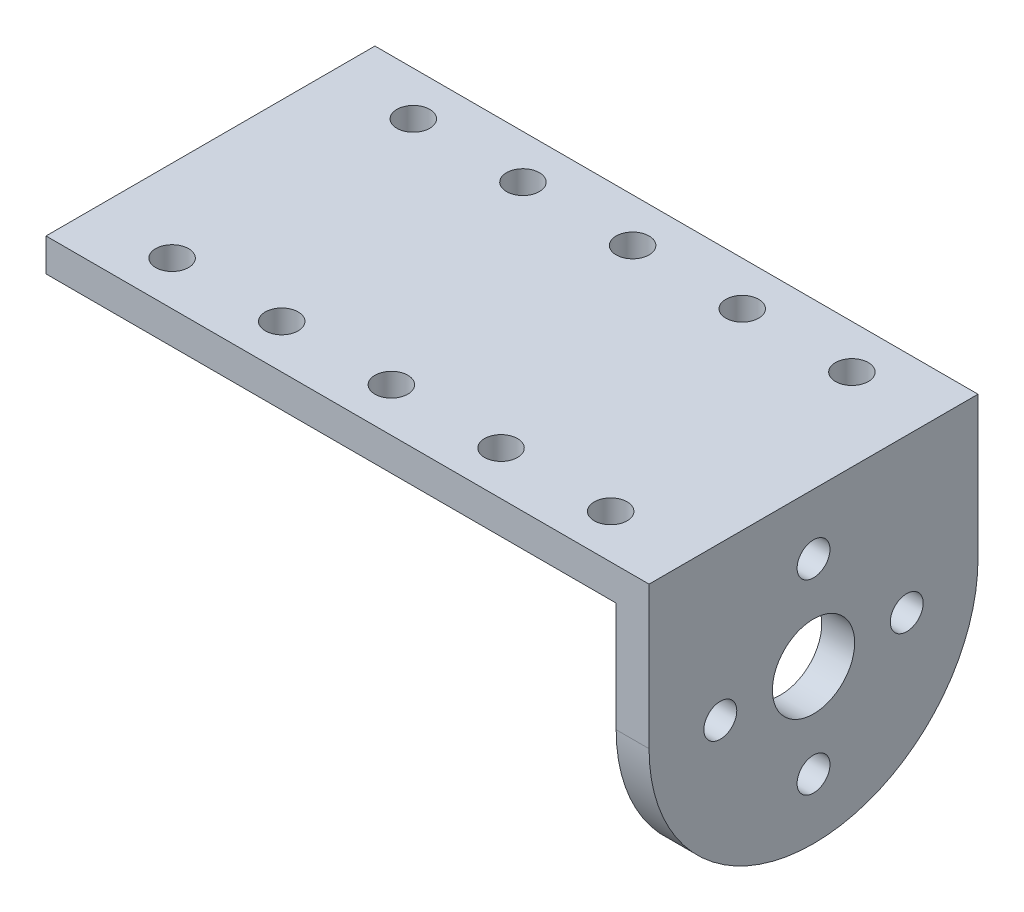
ISO-10303-21;
HEADER;
FILE_DESCRIPTION(('STEP AP214'),'2;1');
FILE_NAME('part.step','',(''),(''),'','','');
FILE_SCHEMA(('AUTOMOTIVE_DESIGN { 1 0 10303 214 1 1 1 1 }'));
ENDSEC;
DATA;
#1=APPLICATION_CONTEXT('core data for automotive mechanical design processes');
#2=APPLICATION_PROTOCOL_DEFINITION('international standard','automotive_design',2000,#1);
#3=PRODUCT_CONTEXT('',#1,'mechanical');
#4=PRODUCT('Part','Part','',(#3));
#5=PRODUCT_RELATED_PRODUCT_CATEGORY('part','',(#4));
#6=PRODUCT_DEFINITION_FORMATION('','',#4);
#7=PRODUCT_DEFINITION_CONTEXT('part definition',#1,'design');
#8=PRODUCT_DEFINITION('design','',#6,#7);
#9=PRODUCT_DEFINITION_SHAPE('','',#8);
#10=(LENGTH_UNIT() NAMED_UNIT(*) SI_UNIT(.MILLI.,.METRE.));
#11=(NAMED_UNIT(*) PLANE_ANGLE_UNIT() SI_UNIT($,.RADIAN.));
#12=(NAMED_UNIT(*) SI_UNIT($,.STERADIAN.) SOLID_ANGLE_UNIT());
#13=UNCERTAINTY_MEASURE_WITH_UNIT(LENGTH_MEASURE(1.E-05),#10,'distance_accuracy_value','');
#14=(GEOMETRIC_REPRESENTATION_CONTEXT(3) GLOBAL_UNCERTAINTY_ASSIGNED_CONTEXT((#13)) GLOBAL_UNIT_ASSIGNED_CONTEXT((#10,
#11,#12)) REPRESENTATION_CONTEXT('',''));
#15=CARTESIAN_POINT('',(0.,0.,0.));
#16=DIRECTION('',(0.,0.,1.));
#17=DIRECTION('',(1.,0.,0.));
#18=AXIS2_PLACEMENT_3D('',#15,#16,#17);
#19=CARTESIAN_POINT('',(0.,0.,0.));
#20=DIRECTION('',(0.,1.,0.));
#21=DIRECTION('',(0.,0.,1.));
#22=AXIS2_PLACEMENT_3D('',#19,#20,#21);
#23=PLANE('',#22);
#24=CARTESIAN_POINT('',(-20.,0.,10.9999999999997));
#25=DIRECTION('',(0.,1.,0.));
#26=DIRECTION('',(0.,0.,-1.));
#27=AXIS2_PLACEMENT_3D('',#24,#25,#26);
#28=CIRCLE('',#27,1.5);
#29=CARTESIAN_POINT('',(-20.,0.,9.49999999999972));
#30=VERTEX_POINT('',#29);
#31=EDGE_CURVE('E132',#30,#30,#28,.T.);
#32=ORIENTED_EDGE('',*,*,#31,.T.);
#33=EDGE_LOOP('',(#32));
#34=FACE_BOUND('',#33,.T.);
#35=CARTESIAN_POINT('',(-10.,0.,10.9999999999998));
#36=DIRECTION('',(0.,1.,0.));
#37=DIRECTION('',(0.,0.,-1.));
#38=AXIS2_PLACEMENT_3D('',#35,#36,#37);
#39=CIRCLE('',#38,1.5);
#40=CARTESIAN_POINT('',(-10.,0.,9.49999999999979));
#41=VERTEX_POINT('',#40);
#42=EDGE_CURVE('E137',#41,#41,#39,.T.);
#43=ORIENTED_EDGE('',*,*,#42,.T.);
#44=EDGE_LOOP('',(#43));
#45=FACE_BOUND('',#44,.T.);
#46=CARTESIAN_POINT('',(0.,0.,10.9999999999999));
#47=DIRECTION('',(0.,1.,0.));
#48=DIRECTION('',(0.,0.,-1.));
#49=AXIS2_PLACEMENT_3D('',#46,#47,#48);
#50=CIRCLE('',#49,1.5);
#51=CARTESIAN_POINT('',(0.,0.,9.49999999999986));
#52=VERTEX_POINT('',#51);
#53=EDGE_CURVE('E145',#52,#52,#50,.T.);
#54=ORIENTED_EDGE('',*,*,#53,.T.);
#55=EDGE_LOOP('',(#54));
#56=FACE_BOUND('',#55,.T.);
#57=CARTESIAN_POINT('',(10.,0.,10.9999999999999));
#58=DIRECTION('',(0.,1.,0.));
#59=DIRECTION('',(0.,0.,-1.));
#60=AXIS2_PLACEMENT_3D('',#57,#58,#59);
#61=CIRCLE('',#60,1.5);
#62=CARTESIAN_POINT('',(10.,0.,9.49999999999993));
#63=VERTEX_POINT('',#62);
#64=EDGE_CURVE('E153',#63,#63,#61,.T.);
#65=ORIENTED_EDGE('',*,*,#64,.T.);
#66=EDGE_LOOP('',(#65));
#67=FACE_BOUND('',#66,.T.);
#68=CARTESIAN_POINT('',(20.,0.,11.));
#69=DIRECTION('',(0.,1.,0.));
#70=DIRECTION('',(0.,0.,-1.));
#71=AXIS2_PLACEMENT_3D('',#68,#69,#70);
#72=CIRCLE('',#71,1.5);
#73=CARTESIAN_POINT('',(20.,0.,9.5));
#74=VERTEX_POINT('',#73);
#75=EDGE_CURVE('E161',#74,#74,#72,.T.);
#76=ORIENTED_EDGE('',*,*,#75,.T.);
#77=EDGE_LOOP('',(#76));
#78=FACE_BOUND('',#77,.T.);
#79=CARTESIAN_POINT('',(-20.,0.,-10.9999999999997));
#80=DIRECTION('',(0.,1.,0.));
#81=DIRECTION('',(0.,0.,1.));
#82=AXIS2_PLACEMENT_3D('',#79,#80,#81);
#83=CIRCLE('',#82,1.5);
#84=CARTESIAN_POINT('',(-20.,0.,-9.49999999999972));
#85=VERTEX_POINT('',#84);
#86=EDGE_CURVE('E169',#85,#85,#83,.T.);
#87=ORIENTED_EDGE('',*,*,#86,.T.);
#88=EDGE_LOOP('',(#87));
#89=FACE_BOUND('',#88,.T.);
#90=CARTESIAN_POINT('',(-10.,0.,-10.9999999999998));
#91=DIRECTION('',(0.,1.,0.));
#92=DIRECTION('',(0.,0.,1.));
#93=AXIS2_PLACEMENT_3D('',#90,#91,#92);
#94=CIRCLE('',#93,1.5);
#95=CARTESIAN_POINT('',(-10.,0.,-9.49999999999979));
#96=VERTEX_POINT('',#95);
#97=EDGE_CURVE('E177',#96,#96,#94,.T.);
#98=ORIENTED_EDGE('',*,*,#97,.T.);
#99=EDGE_LOOP('',(#98));
#100=FACE_BOUND('',#99,.T.);
#101=CARTESIAN_POINT('',(0.,0.,-10.9999999999999));
#102=DIRECTION('',(0.,1.,0.));
#103=DIRECTION('',(0.,0.,1.));
#104=AXIS2_PLACEMENT_3D('',#101,#102,#103);
#105=CIRCLE('',#104,1.5);
#106=CARTESIAN_POINT('',(0.,0.,-9.49999999999986));
#107=VERTEX_POINT('',#106);
#108=EDGE_CURVE('E185',#107,#107,#105,.T.);
#109=ORIENTED_EDGE('',*,*,#108,.T.);
#110=EDGE_LOOP('',(#109));
#111=FACE_BOUND('',#110,.T.);
#112=CARTESIAN_POINT('',(10.,0.,-10.9999999999999));
#113=DIRECTION('',(0.,1.,0.));
#114=DIRECTION('',(0.,0.,1.));
#115=AXIS2_PLACEMENT_3D('',#112,#113,#114);
#116=CIRCLE('',#115,1.5);
#117=CARTESIAN_POINT('',(10.,0.,-9.49999999999993));
#118=VERTEX_POINT('',#117);
#119=EDGE_CURVE('E193',#118,#118,#116,.T.);
#120=ORIENTED_EDGE('',*,*,#119,.T.);
#121=EDGE_LOOP('',(#120));
#122=FACE_BOUND('',#121,.T.);
#123=CARTESIAN_POINT('',(20.,0.,-11.));
#124=DIRECTION('',(0.,1.,0.));
#125=DIRECTION('',(0.,0.,1.));
#126=AXIS2_PLACEMENT_3D('',#123,#124,#125);
#127=CIRCLE('',#126,1.5);
#128=CARTESIAN_POINT('',(20.,0.,-9.5));
#129=VERTEX_POINT('',#128);
#130=EDGE_CURVE('E201',#129,#129,#127,.T.);
#131=ORIENTED_EDGE('',*,*,#130,.T.);
#132=EDGE_LOOP('',(#131));
#133=FACE_BOUND('',#132,.T.);
#134=DIRECTION('',(0.,0.,-1.));
#135=VECTOR('',#134,1.);
#136=CARTESIAN_POINT('',(24.5,0.,15.));
#137=LINE('',#136,#135);
#138=CARTESIAN_POINT('',(24.5,0.,15.));
#139=VERTEX_POINT('',#138);
#140=CARTESIAN_POINT('',(24.5,0.,-15.));
#141=VERTEX_POINT('',#140);
#142=EDGE_CURVE('E107',#139,#141,#137,.T.);
#143=ORIENTED_EDGE('',*,*,#142,.F.);
#144=DIRECTION('',(1.,0.,0.));
#145=VECTOR('',#144,1.);
#146=CARTESIAN_POINT('',(-27.5,0.,15.));
#147=LINE('',#146,#145);
#148=CARTESIAN_POINT('',(-27.5,0.,15.));
#149=VERTEX_POINT('',#148);
#150=EDGE_CURVE('E216',#149,#139,#147,.T.);
#151=ORIENTED_EDGE('',*,*,#150,.F.);
#152=DIRECTION('',(0.,0.,1.));
#153=VECTOR('',#152,1.);
#154=CARTESIAN_POINT('',(-27.5,0.,-15.));
#155=LINE('',#154,#153);
#156=CARTESIAN_POINT('',(-27.5,0.,-15.));
#157=VERTEX_POINT('',#156);
#158=EDGE_CURVE('E114',#157,#149,#155,.T.);
#159=ORIENTED_EDGE('',*,*,#158,.F.);
#160=DIRECTION('',(-1.,0.,0.));
#161=VECTOR('',#160,1.);
#162=CARTESIAN_POINT('',(-27.5,0.,-15.));
#163=LINE('',#162,#161);
#164=EDGE_CURVE('E100',#141,#157,#163,.T.);
#165=ORIENTED_EDGE('',*,*,#164,.F.);
#166=EDGE_LOOP('',(#143,#151,#159,#165));
#167=FACE_BOUND('',#166,.T.);
#168=ADVANCED_FACE('F39',(#34,#45,#56,#67,#78,#89,#100,#111,#122,#133,#167),#23,.F.);
#169=CARTESIAN_POINT('',(0.,3.,0.));
#170=DIRECTION('',(0.,1.,0.));
#171=DIRECTION('',(0.,0.,1.));
#172=AXIS2_PLACEMENT_3D('',#169,#170,#171);
#173=PLANE('',#172);
#174=CARTESIAN_POINT('',(-10.,3.,10.9999999999998));
#175=DIRECTION('',(0.,1.,0.));
#176=DIRECTION('',(0.,0.,-1.));
#177=AXIS2_PLACEMENT_3D('',#174,#175,#176);
#178=CIRCLE('',#177,1.5);
#179=CARTESIAN_POINT('',(-10.,3.,9.49999999999979));
#180=VERTEX_POINT('',#179);
#181=EDGE_CURVE('E141',#180,#180,#178,.T.);
#182=ORIENTED_EDGE('',*,*,#181,.F.);
#183=EDGE_LOOP('',(#182));
#184=FACE_BOUND('',#183,.T.);
#185=CARTESIAN_POINT('',(10.,3.,10.9999999999999));
#186=DIRECTION('',(0.,1.,0.));
#187=DIRECTION('',(0.,0.,-1.));
#188=AXIS2_PLACEMENT_3D('',#185,#186,#187);
#189=CIRCLE('',#188,1.5);
#190=CARTESIAN_POINT('',(10.,3.,9.49999999999993));
#191=VERTEX_POINT('',#190);
#192=EDGE_CURVE('E157',#191,#191,#189,.T.);
#193=ORIENTED_EDGE('',*,*,#192,.F.);
#194=EDGE_LOOP('',(#193));
#195=FACE_BOUND('',#194,.T.);
#196=CARTESIAN_POINT('',(-20.,3.,-10.9999999999997));
#197=DIRECTION('',(0.,1.,0.));
#198=DIRECTION('',(0.,0.,1.));
#199=AXIS2_PLACEMENT_3D('',#196,#197,#198);
#200=CIRCLE('',#199,1.5);
#201=CARTESIAN_POINT('',(-20.,3.,-9.49999999999972));
#202=VERTEX_POINT('',#201);
#203=EDGE_CURVE('E173',#202,#202,#200,.T.);
#204=ORIENTED_EDGE('',*,*,#203,.F.);
#205=EDGE_LOOP('',(#204));
#206=FACE_BOUND('',#205,.T.);
#207=CARTESIAN_POINT('',(0.,3.,-10.9999999999999));
#208=DIRECTION('',(0.,1.,0.));
#209=DIRECTION('',(0.,0.,1.));
#210=AXIS2_PLACEMENT_3D('',#207,#208,#209);
#211=CIRCLE('',#210,1.5);
#212=CARTESIAN_POINT('',(0.,3.,-9.49999999999986));
#213=VERTEX_POINT('',#212);
#214=EDGE_CURVE('E189',#213,#213,#211,.T.);
#215=ORIENTED_EDGE('',*,*,#214,.F.);
#216=EDGE_LOOP('',(#215));
#217=FACE_BOUND('',#216,.T.);
#218=CARTESIAN_POINT('',(20.,3.,-11.));
#219=DIRECTION('',(0.,1.,0.));
#220=DIRECTION('',(0.,0.,1.));
#221=AXIS2_PLACEMENT_3D('',#218,#219,#220);
#222=CIRCLE('',#221,1.5);
#223=CARTESIAN_POINT('',(20.,3.,-9.5));
#224=VERTEX_POINT('',#223);
#225=EDGE_CURVE('E116',#224,#224,#222,.T.);
#226=ORIENTED_EDGE('',*,*,#225,.F.);
#227=EDGE_LOOP('',(#226));
#228=FACE_BOUND('',#227,.T.);
#229=DIRECTION('',(0.,0.,-1.));
#230=VECTOR('',#229,1.);
#231=CARTESIAN_POINT('',(27.5,3.,-15.));
#232=LINE('',#231,#230);
#233=CARTESIAN_POINT('',(27.5,3.,15.));
#234=VERTEX_POINT('',#233);
#235=CARTESIAN_POINT('',(27.5,3.,-15.));
#236=VERTEX_POINT('',#235);
#237=EDGE_CURVE('E211',#234,#236,#232,.T.);
#238=ORIENTED_EDGE('',*,*,#237,.T.);
#239=DIRECTION('',(-1.,0.,0.));
#240=VECTOR('',#239,1.);
#241=CARTESIAN_POINT('',(-27.5,3.,-15.));
#242=LINE('',#241,#240);
#243=CARTESIAN_POINT('',(-27.5,3.,-15.));
#244=VERTEX_POINT('',#243);
#245=EDGE_CURVE('E215',#236,#244,#242,.T.);
#246=ORIENTED_EDGE('',*,*,#245,.T.);
#247=DIRECTION('',(0.,0.,1.));
#248=VECTOR('',#247,1.);
#249=CARTESIAN_POINT('',(-27.5,3.,-15.));
#250=LINE('',#249,#248);
#251=CARTESIAN_POINT('',(-27.5,3.,15.));
#252=VERTEX_POINT('',#251);
#253=EDGE_CURVE('E219',#244,#252,#250,.T.);
#254=ORIENTED_EDGE('',*,*,#253,.T.);
#255=DIRECTION('',(1.,0.,0.));
#256=VECTOR('',#255,1.);
#257=CARTESIAN_POINT('',(-27.5,3.,15.));
#258=LINE('',#257,#256);
#259=EDGE_CURVE('E222',#252,#234,#258,.T.);
#260=ORIENTED_EDGE('',*,*,#259,.T.);
#261=EDGE_LOOP('',(#238,#246,#254,#260));
#262=FACE_BOUND('',#261,.T.);
#263=CARTESIAN_POINT('',(10.,3.,-10.9999999999999));
#264=DIRECTION('',(0.,1.,0.));
#265=DIRECTION('',(0.,0.,1.));
#266=AXIS2_PLACEMENT_3D('',#263,#264,#265);
#267=CIRCLE('',#266,1.5);
#268=CARTESIAN_POINT('',(10.,3.,-9.49999999999993));
#269=VERTEX_POINT('',#268);
#270=EDGE_CURVE('E197',#269,#269,#267,.T.);
#271=ORIENTED_EDGE('',*,*,#270,.F.);
#272=EDGE_LOOP('',(#271));
#273=FACE_BOUND('',#272,.T.);
#274=CARTESIAN_POINT('',(-10.,3.,-10.9999999999998));
#275=DIRECTION('',(0.,1.,0.));
#276=DIRECTION('',(0.,0.,1.));
#277=AXIS2_PLACEMENT_3D('',#274,#275,#276);
#278=CIRCLE('',#277,1.5);
#279=CARTESIAN_POINT('',(-10.,3.,-9.49999999999979));
#280=VERTEX_POINT('',#279);
#281=EDGE_CURVE('E181',#280,#280,#278,.T.);
#282=ORIENTED_EDGE('',*,*,#281,.F.);
#283=EDGE_LOOP('',(#282));
#284=FACE_BOUND('',#283,.T.);
#285=CARTESIAN_POINT('',(20.,3.,11.));
#286=DIRECTION('',(0.,1.,0.));
#287=DIRECTION('',(0.,0.,-1.));
#288=AXIS2_PLACEMENT_3D('',#285,#286,#287);
#289=CIRCLE('',#288,1.5);
#290=CARTESIAN_POINT('',(20.,3.,9.5));
#291=VERTEX_POINT('',#290);
#292=EDGE_CURVE('E165',#291,#291,#289,.T.);
#293=ORIENTED_EDGE('',*,*,#292,.F.);
#294=EDGE_LOOP('',(#293));
#295=FACE_BOUND('',#294,.T.);
#296=CARTESIAN_POINT('',(0.,3.,10.9999999999999));
#297=DIRECTION('',(0.,1.,0.));
#298=DIRECTION('',(0.,0.,-1.));
#299=AXIS2_PLACEMENT_3D('',#296,#297,#298);
#300=CIRCLE('',#299,1.5);
#301=CARTESIAN_POINT('',(0.,3.,9.49999999999986));
#302=VERTEX_POINT('',#301);
#303=EDGE_CURVE('E149',#302,#302,#300,.T.);
#304=ORIENTED_EDGE('',*,*,#303,.F.);
#305=EDGE_LOOP('',(#304));
#306=FACE_BOUND('',#305,.T.);
#307=CARTESIAN_POINT('',(-20.,3.,10.9999999999997));
#308=DIRECTION('',(0.,1.,0.));
#309=DIRECTION('',(0.,0.,-1.));
#310=AXIS2_PLACEMENT_3D('',#307,#308,#309);
#311=CIRCLE('',#310,1.5);
#312=CARTESIAN_POINT('',(-20.,3.,9.49999999999972));
#313=VERTEX_POINT('',#312);
#314=EDGE_CURVE('E133',#313,#313,#311,.T.);
#315=ORIENTED_EDGE('',*,*,#314,.F.);
#316=EDGE_LOOP('',(#315));
#317=FACE_BOUND('',#316,.T.);
#318=ADVANCED_FACE('F312',(#184,#195,#206,#217,#228,#262,#273,#284,#295,#306,#317),#173,.T.);
#319=CARTESIAN_POINT('',(27.5,3.,-15.));
#320=DIRECTION('',(-1.,0.,0.));
#321=DIRECTION('',(0.,0.,1.));
#322=AXIS2_PLACEMENT_3D('',#319,#320,#321);
#323=PLANE('',#322);
#324=CARTESIAN_POINT('',(27.5,-19.5,0.));
#325=DIRECTION('',(1.,0.,0.));
#326=DIRECTION('',(0.,0.,-1.));
#327=AXIS2_PLACEMENT_3D('',#324,#325,#326);
#328=CIRCLE('',#327,1.5);
#329=CARTESIAN_POINT('',(27.5,-19.5,-1.5));
#330=VERTEX_POINT('',#329);
#331=EDGE_CURVE('E124',#330,#330,#328,.T.);
#332=ORIENTED_EDGE('',*,*,#331,.F.);
#333=EDGE_LOOP('',(#332));
#334=FACE_BOUND('',#333,.T.);
#335=CARTESIAN_POINT('',(27.5,-11.,0.));
#336=DIRECTION('',(1.,0.,0.));
#337=DIRECTION('',(0.,0.,-1.));
#338=AXIS2_PLACEMENT_3D('',#335,#336,#337);
#339=CIRCLE('',#338,3.75);
#340=CARTESIAN_POINT('',(27.5,-11.,-3.75));
#341=VERTEX_POINT('',#340);
#342=EDGE_CURVE('E266',#341,#341,#339,.T.);
#343=ORIENTED_EDGE('',*,*,#342,.F.);
#344=EDGE_LOOP('',(#343));
#345=FACE_BOUND('',#344,.T.);
#346=CARTESIAN_POINT('',(27.5,-11.,-8.5));
#347=DIRECTION('',(1.,0.,0.));
#348=DIRECTION('',(0.,0.,-1.));
#349=AXIS2_PLACEMENT_3D('',#346,#347,#348);
#350=CIRCLE('',#349,1.5);
#351=CARTESIAN_POINT('',(27.5,-11.,-10.));
#352=VERTEX_POINT('',#351);
#353=EDGE_CURVE('E275',#352,#352,#350,.T.);
#354=ORIENTED_EDGE('',*,*,#353,.F.);
#355=EDGE_LOOP('',(#354));
#356=FACE_BOUND('',#355,.T.);
#357=CARTESIAN_POINT('',(27.5,-2.5,0.));
#358=DIRECTION('',(1.,0.,0.));
#359=DIRECTION('',(0.,0.,-1.));
#360=AXIS2_PLACEMENT_3D('',#357,#358,#359);
#361=CIRCLE('',#360,1.5);
#362=CARTESIAN_POINT('',(27.5,-2.5,-1.5));
#363=VERTEX_POINT('',#362);
#364=EDGE_CURVE('E288',#363,#363,#361,.T.);
#365=ORIENTED_EDGE('',*,*,#364,.F.);
#366=EDGE_LOOP('',(#365));
#367=FACE_BOUND('',#366,.T.);
#368=CARTESIAN_POINT('',(27.5,-11.,8.5));
#369=DIRECTION('',(1.,0.,0.));
#370=DIRECTION('',(0.,0.,-1.));
#371=AXIS2_PLACEMENT_3D('',#368,#369,#370);
#372=CIRCLE('',#371,1.5);
#373=CARTESIAN_POINT('',(27.5,-11.,7.));
#374=VERTEX_POINT('',#373);
#375=EDGE_CURVE('E281',#374,#374,#372,.T.);
#376=ORIENTED_EDGE('',*,*,#375,.F.);
#377=EDGE_LOOP('',(#376));
#378=FACE_BOUND('',#377,.T.);
#379=CARTESIAN_POINT('',(27.5,-10.,0.));
#380=DIRECTION('',(-1.,0.,0.));
#381=DIRECTION('',(0.,0.,1.));
#382=AXIS2_PLACEMENT_3D('',#379,#380,#381);
#383=CIRCLE('',#382,15.);
#384=CARTESIAN_POINT('',(27.5,-10.,15.));
#385=VERTEX_POINT('',#384);
#386=CARTESIAN_POINT('',(27.5,-25.,0.));
#387=VERTEX_POINT('',#386);
#388=EDGE_CURVE('E243',#385,#387,#383,.F.);
#389=ORIENTED_EDGE('',*,*,#388,.T.);
#390=CARTESIAN_POINT('',(27.5,-10.,0.));
#391=DIRECTION('',(-1.,0.,0.));
#392=DIRECTION('',(0.,0.,1.));
#393=AXIS2_PLACEMENT_3D('',#390,#391,#392);
#394=CIRCLE('',#393,15.);
#395=CARTESIAN_POINT('',(27.5,-10.,-15.));
#396=VERTEX_POINT('',#395);
#397=EDGE_CURVE('E246',#387,#396,#394,.F.);
#398=ORIENTED_EDGE('',*,*,#397,.T.);
#399=DIRECTION('',(0.,-1.,0.));
#400=VECTOR('',#399,1.);
#401=CARTESIAN_POINT('',(27.5,3.,-15.));
#402=LINE('',#401,#400);
#403=EDGE_CURVE('E240',#236,#396,#402,.T.);
#404=ORIENTED_EDGE('',*,*,#403,.F.);
#405=ORIENTED_EDGE('',*,*,#237,.F.);
#406=DIRECTION('',(0.,-1.,0.));
#407=VECTOR('',#406,1.);
#408=CARTESIAN_POINT('',(27.5,3.,15.));
#409=LINE('',#408,#407);
#410=EDGE_CURVE('E224',#234,#385,#409,.T.);
#411=ORIENTED_EDGE('',*,*,#410,.T.);
#412=EDGE_LOOP('',(#389,#398,#404,#405,#411));
#413=FACE_BOUND('',#412,.T.);
#414=ADVANCED_FACE('F257',(#334,#345,#356,#367,#378,#413),#323,.F.);
#415=CARTESIAN_POINT('',(-27.5,3.,-15.));
#416=DIRECTION('',(0.,0.,1.));
#417=DIRECTION('',(1.,0.,0.));
#418=AXIS2_PLACEMENT_3D('',#415,#416,#417);
#419=PLANE('',#418);
#420=ORIENTED_EDGE('',*,*,#403,.T.);
#421=DIRECTION('',(1.,0.,0.));
#422=VECTOR('',#421,1.);
#423=CARTESIAN_POINT('',(-27.5,-10.,-15.));
#424=LINE('',#423,#422);
#425=CARTESIAN_POINT('',(24.5,-10.,-15.));
#426=VERTEX_POINT('',#425);
#427=EDGE_CURVE('E103',#396,#426,#424,.F.);
#428=ORIENTED_EDGE('',*,*,#427,.T.);
#429=DIRECTION('',(0.,1.,0.));
#430=VECTOR('',#429,1.);
#431=CARTESIAN_POINT('',(24.5,-25.,-15.));
#432=LINE('',#431,#430);
#433=EDGE_CURVE('E95',#426,#141,#432,.T.);
#434=ORIENTED_EDGE('',*,*,#433,.T.);
#435=ORIENTED_EDGE('',*,*,#164,.T.);
#436=DIRECTION('',(0.,-1.,0.));
#437=VECTOR('',#436,1.);
#438=CARTESIAN_POINT('',(-27.5,3.,-15.));
#439=LINE('',#438,#437);
#440=EDGE_CURVE('E237',#244,#157,#439,.T.);
#441=ORIENTED_EDGE('',*,*,#440,.F.);
#442=ORIENTED_EDGE('',*,*,#245,.F.);
#443=EDGE_LOOP('',(#420,#428,#434,#435,#441,#442));
#444=FACE_BOUND('',#443,.T.);
#445=ADVANCED_FACE('F98',(#444),#419,.F.);
#446=CARTESIAN_POINT('',(-27.5,3.,-15.));
#447=DIRECTION('',(1.,0.,0.));
#448=DIRECTION('',(0.,0.,-1.));
#449=AXIS2_PLACEMENT_3D('',#446,#447,#448);
#450=PLANE('',#449);
#451=ORIENTED_EDGE('',*,*,#158,.T.);
#452=DIRECTION('',(0.,-1.,0.));
#453=VECTOR('',#452,1.);
#454=CARTESIAN_POINT('',(-27.5,3.,15.));
#455=LINE('',#454,#453);
#456=EDGE_CURVE('E233',#252,#149,#455,.T.);
#457=ORIENTED_EDGE('',*,*,#456,.F.);
#458=ORIENTED_EDGE('',*,*,#253,.F.);
#459=ORIENTED_EDGE('',*,*,#440,.T.);
#460=EDGE_LOOP('',(#451,#457,#458,#459));
#461=FACE_BOUND('',#460,.T.);
#462=ADVANCED_FACE('F350',(#461),#450,.F.);
#463=CARTESIAN_POINT('',(-27.5,3.,15.));
#464=DIRECTION('',(0.,0.,-1.));
#465=DIRECTION('',(-1.,0.,0.));
#466=AXIS2_PLACEMENT_3D('',#463,#464,#465);
#467=PLANE('',#466);
#468=DIRECTION('',(0.,1.,0.));
#469=VECTOR('',#468,1.);
#470=CARTESIAN_POINT('',(24.5,-25.,15.));
#471=LINE('',#470,#469);
#472=CARTESIAN_POINT('',(24.5,-10.,15.));
#473=VERTEX_POINT('',#472);
#474=EDGE_CURVE('E106',#473,#139,#471,.T.);
#475=ORIENTED_EDGE('',*,*,#474,.F.);
#476=DIRECTION('',(-1.,0.,0.));
#477=VECTOR('',#476,1.);
#478=CARTESIAN_POINT('',(-27.5,-10.,15.));
#479=LINE('',#478,#477);
#480=EDGE_CURVE('E11',#473,#385,#479,.F.);
#481=ORIENTED_EDGE('',*,*,#480,.T.);
#482=ORIENTED_EDGE('',*,*,#410,.F.);
#483=ORIENTED_EDGE('',*,*,#259,.F.);
#484=ORIENTED_EDGE('',*,*,#456,.T.);
#485=ORIENTED_EDGE('',*,*,#150,.T.);
#486=EDGE_LOOP('',(#475,#481,#482,#483,#484,#485));
#487=FACE_BOUND('',#486,.T.);
#488=ADVANCED_FACE('F346',(#487),#467,.F.);
#489=CARTESIAN_POINT('',(20.,3.,-11.));
#490=DIRECTION('',(0.,-1.,0.));
#491=DIRECTION('',(0.,0.,-1.));
#492=AXIS2_PLACEMENT_3D('',#489,#490,#491);
#493=CYLINDRICAL_SURFACE('',#492,1.5);
#494=ORIENTED_EDGE('',*,*,#225,.T.);
#495=EDGE_LOOP('',(#494));
#496=FACE_BOUND('',#495,.T.);
#497=ORIENTED_EDGE('',*,*,#130,.F.);
#498=EDGE_LOOP('',(#497));
#499=FACE_BOUND('',#498,.T.);
#500=ADVANCED_FACE('F349',(#496,#499),#493,.F.);
#501=CARTESIAN_POINT('',(10.,3.,-10.9999999999999));
#502=DIRECTION('',(0.,-1.,0.));
#503=DIRECTION('',(0.,0.,-1.));
#504=AXIS2_PLACEMENT_3D('',#501,#502,#503);
#505=CYLINDRICAL_SURFACE('',#504,1.5);
#506=ORIENTED_EDGE('',*,*,#270,.T.);
#507=EDGE_LOOP('',(#506));
#508=FACE_BOUND('',#507,.T.);
#509=ORIENTED_EDGE('',*,*,#119,.F.);
#510=EDGE_LOOP('',(#509));
#511=FACE_BOUND('',#510,.T.);
#512=ADVANCED_FACE('F417',(#508,#511),#505,.F.);
#513=CARTESIAN_POINT('',(0.,3.,-10.9999999999999));
#514=DIRECTION('',(0.,-1.,0.));
#515=DIRECTION('',(0.,0.,-1.));
#516=AXIS2_PLACEMENT_3D('',#513,#514,#515);
#517=CYLINDRICAL_SURFACE('',#516,1.5);
#518=ORIENTED_EDGE('',*,*,#214,.T.);
#519=EDGE_LOOP('',(#518));
#520=FACE_BOUND('',#519,.T.);
#521=ORIENTED_EDGE('',*,*,#108,.F.);
#522=EDGE_LOOP('',(#521));
#523=FACE_BOUND('',#522,.T.);
#524=ADVANCED_FACE('F413',(#520,#523),#517,.F.);
#525=CARTESIAN_POINT('',(-10.,3.,-10.9999999999998));
#526=DIRECTION('',(0.,-1.,0.));
#527=DIRECTION('',(0.,0.,-1.));
#528=AXIS2_PLACEMENT_3D('',#525,#526,#527);
#529=CYLINDRICAL_SURFACE('',#528,1.5);
#530=ORIENTED_EDGE('',*,*,#281,.T.);
#531=EDGE_LOOP('',(#530));
#532=FACE_BOUND('',#531,.T.);
#533=ORIENTED_EDGE('',*,*,#97,.F.);
#534=EDGE_LOOP('',(#533));
#535=FACE_BOUND('',#534,.T.);
#536=ADVANCED_FACE('F409',(#532,#535),#529,.F.);
#537=CARTESIAN_POINT('',(-20.,3.,-10.9999999999997));
#538=DIRECTION('',(0.,-1.,0.));
#539=DIRECTION('',(0.,0.,-1.));
#540=AXIS2_PLACEMENT_3D('',#537,#538,#539);
#541=CYLINDRICAL_SURFACE('',#540,1.5);
#542=ORIENTED_EDGE('',*,*,#203,.T.);
#543=EDGE_LOOP('',(#542));
#544=FACE_BOUND('',#543,.T.);
#545=ORIENTED_EDGE('',*,*,#86,.F.);
#546=EDGE_LOOP('',(#545));
#547=FACE_BOUND('',#546,.T.);
#548=ADVANCED_FACE('F405',(#544,#547),#541,.F.);
#549=CARTESIAN_POINT('',(20.,3.,11.));
#550=DIRECTION('',(0.,-1.,0.));
#551=DIRECTION('',(0.,0.,-1.));
#552=AXIS2_PLACEMENT_3D('',#549,#550,#551);
#553=CYLINDRICAL_SURFACE('',#552,1.5);
#554=ORIENTED_EDGE('',*,*,#292,.T.);
#555=EDGE_LOOP('',(#554));
#556=FACE_BOUND('',#555,.T.);
#557=ORIENTED_EDGE('',*,*,#75,.F.);
#558=EDGE_LOOP('',(#557));
#559=FACE_BOUND('',#558,.T.);
#560=ADVANCED_FACE('F401',(#556,#559),#553,.F.);
#561=CARTESIAN_POINT('',(10.,3.,10.9999999999999));
#562=DIRECTION('',(0.,-1.,0.));
#563=DIRECTION('',(0.,0.,-1.));
#564=AXIS2_PLACEMENT_3D('',#561,#562,#563);
#565=CYLINDRICAL_SURFACE('',#564,1.5);
#566=ORIENTED_EDGE('',*,*,#192,.T.);
#567=EDGE_LOOP('',(#566));
#568=FACE_BOUND('',#567,.T.);
#569=ORIENTED_EDGE('',*,*,#64,.F.);
#570=EDGE_LOOP('',(#569));
#571=FACE_BOUND('',#570,.T.);
#572=ADVANCED_FACE('F397',(#568,#571),#565,.F.);
#573=CARTESIAN_POINT('',(0.,3.,10.9999999999999));
#574=DIRECTION('',(0.,-1.,0.));
#575=DIRECTION('',(0.,0.,-1.));
#576=AXIS2_PLACEMENT_3D('',#573,#574,#575);
#577=CYLINDRICAL_SURFACE('',#576,1.5);
#578=ORIENTED_EDGE('',*,*,#303,.T.);
#579=EDGE_LOOP('',(#578));
#580=FACE_BOUND('',#579,.T.);
#581=ORIENTED_EDGE('',*,*,#53,.F.);
#582=EDGE_LOOP('',(#581));
#583=FACE_BOUND('',#582,.T.);
#584=ADVANCED_FACE('F391',(#580,#583),#577,.F.);
#585=CARTESIAN_POINT('',(-10.,3.,10.9999999999998));
#586=DIRECTION('',(0.,-1.,0.));
#587=DIRECTION('',(0.,0.,-1.));
#588=AXIS2_PLACEMENT_3D('',#585,#586,#587);
#589=CYLINDRICAL_SURFACE('',#588,1.5);
#590=ORIENTED_EDGE('',*,*,#181,.T.);
#591=EDGE_LOOP('',(#590));
#592=FACE_BOUND('',#591,.T.);
#593=ORIENTED_EDGE('',*,*,#42,.F.);
#594=EDGE_LOOP('',(#593));
#595=FACE_BOUND('',#594,.T.);
#596=ADVANCED_FACE('F385',(#592,#595),#589,.F.);
#597=CARTESIAN_POINT('',(-20.,3.,10.9999999999997));
#598=DIRECTION('',(0.,-1.,0.));
#599=DIRECTION('',(0.,0.,-1.));
#600=AXIS2_PLACEMENT_3D('',#597,#598,#599);
#601=CYLINDRICAL_SURFACE('',#600,1.5);
#602=ORIENTED_EDGE('',*,*,#314,.T.);
#603=EDGE_LOOP('',(#602));
#604=FACE_BOUND('',#603,.T.);
#605=ORIENTED_EDGE('',*,*,#31,.F.);
#606=EDGE_LOOP('',(#605));
#607=FACE_BOUND('',#606,.T.);
#608=ADVANCED_FACE('F331',(#604,#607),#601,.F.);
#609=CARTESIAN_POINT('',(24.5,-25.,15.));
#610=DIRECTION('',(1.,0.,0.));
#611=DIRECTION('',(0.,0.,-1.));
#612=AXIS2_PLACEMENT_3D('',#609,#610,#611);
#613=PLANE('',#612);
#614=CARTESIAN_POINT('',(24.5,-19.5,0.));
#615=DIRECTION('',(1.,0.,0.));
#616=DIRECTION('',(0.,0.,-1.));
#617=AXIS2_PLACEMENT_3D('',#614,#615,#616);
#618=CIRCLE('',#617,1.5);
#619=CARTESIAN_POINT('',(24.5,-19.5,-1.5));
#620=VERTEX_POINT('',#619);
#621=EDGE_CURVE('E120',#620,#620,#618,.F.);
#622=ORIENTED_EDGE('',*,*,#621,.F.);
#623=EDGE_LOOP('',(#622));
#624=FACE_BOUND('',#623,.T.);
#625=CARTESIAN_POINT('',(24.5,-11.,0.));
#626=DIRECTION('',(1.,0.,0.));
#627=DIRECTION('',(0.,0.,-1.));
#628=AXIS2_PLACEMENT_3D('',#625,#626,#627);
#629=CIRCLE('',#628,3.75);
#630=CARTESIAN_POINT('',(24.5,-11.,-3.75));
#631=VERTEX_POINT('',#630);
#632=EDGE_CURVE('E269',#631,#631,#629,.F.);
#633=ORIENTED_EDGE('',*,*,#632,.F.);
#634=EDGE_LOOP('',(#633));
#635=FACE_BOUND('',#634,.T.);
#636=CARTESIAN_POINT('',(24.5,-11.,-8.5));
#637=DIRECTION('',(1.,0.,0.));
#638=DIRECTION('',(0.,0.,-1.));
#639=AXIS2_PLACEMENT_3D('',#636,#637,#638);
#640=CIRCLE('',#639,1.5);
#641=CARTESIAN_POINT('',(24.5,-11.,-10.));
#642=VERTEX_POINT('',#641);
#643=EDGE_CURVE('E278',#642,#642,#640,.F.);
#644=ORIENTED_EDGE('',*,*,#643,.F.);
#645=EDGE_LOOP('',(#644));
#646=FACE_BOUND('',#645,.T.);
#647=CARTESIAN_POINT('',(24.5,-2.5,0.));
#648=DIRECTION('',(1.,0.,0.));
#649=DIRECTION('',(0.,0.,-1.));
#650=AXIS2_PLACEMENT_3D('',#647,#648,#649);
#651=CIRCLE('',#650,1.5);
#652=CARTESIAN_POINT('',(24.5,-2.5,-1.5));
#653=VERTEX_POINT('',#652);
#654=EDGE_CURVE('E127',#653,#653,#651,.F.);
#655=ORIENTED_EDGE('',*,*,#654,.F.);
#656=EDGE_LOOP('',(#655));
#657=FACE_BOUND('',#656,.T.);
#658=CARTESIAN_POINT('',(24.5,-11.,8.5));
#659=DIRECTION('',(1.,0.,0.));
#660=DIRECTION('',(0.,0.,-1.));
#661=AXIS2_PLACEMENT_3D('',#658,#659,#660);
#662=CIRCLE('',#661,1.5);
#663=CARTESIAN_POINT('',(24.5,-11.,7.));
#664=VERTEX_POINT('',#663);
#665=EDGE_CURVE('E285',#664,#664,#662,.F.);
#666=ORIENTED_EDGE('',*,*,#665,.F.);
#667=EDGE_LOOP('',(#666));
#668=FACE_BOUND('',#667,.T.);
#669=ORIENTED_EDGE('',*,*,#433,.F.);
#670=CARTESIAN_POINT('',(24.5,-10.,0.));
#671=DIRECTION('',(1.,0.,0.));
#672=DIRECTION('',(0.,0.,-1.));
#673=AXIS2_PLACEMENT_3D('',#670,#671,#672);
#674=CIRCLE('',#673,15.);
#675=CARTESIAN_POINT('',(24.5,-25.,0.));
#676=VERTEX_POINT('',#675);
#677=EDGE_CURVE('E49',#426,#676,#674,.F.);
#678=ORIENTED_EDGE('',*,*,#677,.T.);
#679=CARTESIAN_POINT('',(24.5,-10.,0.));
#680=DIRECTION('',(1.,0.,0.));
#681=DIRECTION('',(0.,0.,-1.));
#682=AXIS2_PLACEMENT_3D('',#679,#680,#681);
#683=CIRCLE('',#682,15.);
#684=EDGE_CURVE('E56',#676,#473,#683,.F.);
#685=ORIENTED_EDGE('',*,*,#684,.T.);
#686=ORIENTED_EDGE('',*,*,#474,.T.);
#687=ORIENTED_EDGE('',*,*,#142,.T.);
#688=EDGE_LOOP('',(#669,#678,#685,#686,#687));
#689=FACE_BOUND('',#688,.T.);
#690=ADVANCED_FACE('F118',(#624,#635,#646,#657,#668,#689),#613,.F.);
#691=CARTESIAN_POINT('',(13.8933982822018,-11.,8.5));
#692=DIRECTION('',(1.,0.,0.));
#693=DIRECTION('',(0.,0.,-1.));
#694=AXIS2_PLACEMENT_3D('',#691,#692,#693);
#695=CYLINDRICAL_SURFACE('',#694,1.5);
#696=ORIENTED_EDGE('',*,*,#665,.T.);
#697=EDGE_LOOP('',(#696));
#698=FACE_BOUND('',#697,.T.);
#699=ORIENTED_EDGE('',*,*,#375,.T.);
#700=EDGE_LOOP('',(#699));
#701=FACE_BOUND('',#700,.T.);
#702=ADVANCED_FACE('F319',(#698,#701),#695,.F.);
#703=CARTESIAN_POINT('',(13.8933982822018,-2.5,0.));
#704=DIRECTION('',(1.,0.,0.));
#705=DIRECTION('',(0.,0.,-1.));
#706=AXIS2_PLACEMENT_3D('',#703,#704,#705);
#707=CYLINDRICAL_SURFACE('',#706,1.5);
#708=ORIENTED_EDGE('',*,*,#654,.T.);
#709=EDGE_LOOP('',(#708));
#710=FACE_BOUND('',#709,.T.);
#711=ORIENTED_EDGE('',*,*,#364,.T.);
#712=EDGE_LOOP('',(#711));
#713=FACE_BOUND('',#712,.T.);
#714=ADVANCED_FACE('F321',(#710,#713),#707,.F.);
#715=CARTESIAN_POINT('',(13.8933982822018,-11.,-8.5));
#716=DIRECTION('',(1.,0.,0.));
#717=DIRECTION('',(0.,0.,-1.));
#718=AXIS2_PLACEMENT_3D('',#715,#716,#717);
#719=CYLINDRICAL_SURFACE('',#718,1.5);
#720=ORIENTED_EDGE('',*,*,#643,.T.);
#721=EDGE_LOOP('',(#720));
#722=FACE_BOUND('',#721,.T.);
#723=ORIENTED_EDGE('',*,*,#353,.T.);
#724=EDGE_LOOP('',(#723));
#725=FACE_BOUND('',#724,.T.);
#726=ADVANCED_FACE('F328',(#722,#725),#719,.F.);
#727=CARTESIAN_POINT('',(13.8933982822018,-11.,0.));
#728=DIRECTION('',(1.,0.,0.));
#729=DIRECTION('',(0.,0.,-1.));
#730=AXIS2_PLACEMENT_3D('',#727,#728,#729);
#731=CYLINDRICAL_SURFACE('',#730,3.75);
#732=ORIENTED_EDGE('',*,*,#632,.T.);
#733=EDGE_LOOP('',(#732));
#734=FACE_BOUND('',#733,.T.);
#735=ORIENTED_EDGE('',*,*,#342,.T.);
#736=EDGE_LOOP('',(#735));
#737=FACE_BOUND('',#736,.T.);
#738=ADVANCED_FACE('F363',(#734,#737),#731,.F.);
#739=CARTESIAN_POINT('',(13.8933982822018,-19.5,0.));
#740=DIRECTION('',(1.,0.,0.));
#741=DIRECTION('',(0.,0.,-1.));
#742=AXIS2_PLACEMENT_3D('',#739,#740,#741);
#743=CYLINDRICAL_SURFACE('',#742,1.5);
#744=ORIENTED_EDGE('',*,*,#621,.T.);
#745=EDGE_LOOP('',(#744));
#746=FACE_BOUND('',#745,.T.);
#747=ORIENTED_EDGE('',*,*,#331,.T.);
#748=EDGE_LOOP('',(#747));
#749=FACE_BOUND('',#748,.T.);
#750=ADVANCED_FACE('F308',(#746,#749),#743,.F.);
#751=CARTESIAN_POINT('',(0.,-10.,0.));
#752=DIRECTION('',(-1.,0.,0.));
#753=DIRECTION('',(0.,0.,1.));
#754=AXIS2_PLACEMENT_3D('',#751,#752,#753);
#755=CYLINDRICAL_SURFACE('',#754,15.);
#756=ORIENTED_EDGE('',*,*,#480,.F.);
#757=ORIENTED_EDGE('',*,*,#684,.F.);
#758=DIRECTION('',(-1.,0.,0.));
#759=VECTOR('',#758,1.);
#760=CARTESIAN_POINT('',(0.,-25.,0.));
#761=LINE('',#760,#759);
#762=EDGE_CURVE('E43',#387,#676,#761,.T.);
#763=ORIENTED_EDGE('',*,*,#762,.F.);
#764=ORIENTED_EDGE('',*,*,#388,.F.);
#765=EDGE_LOOP('',(#756,#757,#763,#764));
#766=FACE_BOUND('',#765,.T.);
#767=ADVANCED_FACE('F41',(#766),#755,.T.);
#768=CARTESIAN_POINT('',(0.,-10.,0.));
#769=DIRECTION('',(1.,0.,0.));
#770=DIRECTION('',(0.,0.,-1.));
#771=AXIS2_PLACEMENT_3D('',#768,#769,#770);
#772=CYLINDRICAL_SURFACE('',#771,15.);
#773=ORIENTED_EDGE('',*,*,#677,.F.);
#774=ORIENTED_EDGE('',*,*,#427,.F.);
#775=ORIENTED_EDGE('',*,*,#397,.F.);
#776=ORIENTED_EDGE('',*,*,#762,.T.);
#777=EDGE_LOOP('',(#773,#774,#775,#776));
#778=FACE_BOUND('',#777,.T.);
#779=ADVANCED_FACE('F263',(#778),#772,.T.);
#780=CLOSED_SHELL('',(#168,#318,#414,#445,#462,#488,#500,#512,#524,#536,#548,#560,#572,#584,
#596,#608,#690,#702,#714,#726,#738,#750,#767,#779));
#781=MANIFOLD_SOLID_BREP('B2',#780);
#782=ADVANCED_BREP_SHAPE_REPRESENTATION('',(#18,#781),#14);
#783=SHAPE_DEFINITION_REPRESENTATION(#9,#782);
ENDSEC;
END-ISO-10303-21;
